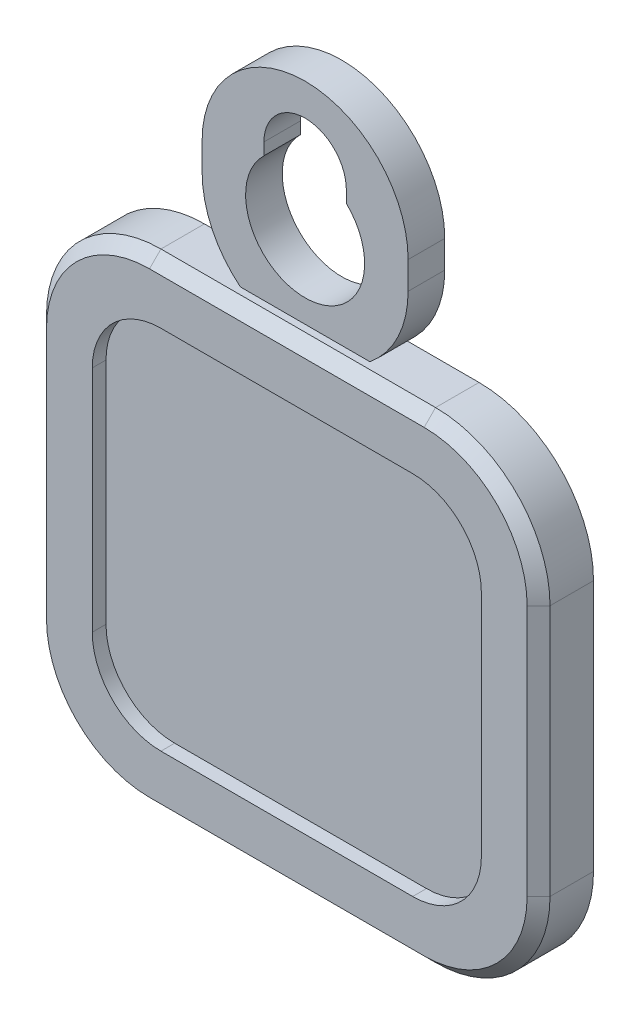
ISO-10303-21;
HEADER;
FILE_DESCRIPTION(('STEP AP214'),'2;1');
FILE_NAME('part.step','',(''),(''),'','','');
FILE_SCHEMA(('AUTOMOTIVE_DESIGN { 1 0 10303 214 1 1 1 1 }'));
ENDSEC;
DATA;
#1=APPLICATION_CONTEXT('core data for automotive mechanical design processes');
#2=APPLICATION_PROTOCOL_DEFINITION('international standard','automotive_design',2000,#1);
#3=PRODUCT_CONTEXT('',#1,'mechanical');
#4=PRODUCT('Part','Part','',(#3));
#5=PRODUCT_RELATED_PRODUCT_CATEGORY('part','',(#4));
#6=PRODUCT_DEFINITION_FORMATION('','',#4);
#7=PRODUCT_DEFINITION_CONTEXT('part definition',#1,'design');
#8=PRODUCT_DEFINITION('design','',#6,#7);
#9=PRODUCT_DEFINITION_SHAPE('','',#8);
#10=(LENGTH_UNIT() NAMED_UNIT(*) SI_UNIT(.MILLI.,.METRE.));
#11=(NAMED_UNIT(*) PLANE_ANGLE_UNIT() SI_UNIT($,.RADIAN.));
#12=(NAMED_UNIT(*) SI_UNIT($,.STERADIAN.) SOLID_ANGLE_UNIT());
#13=UNCERTAINTY_MEASURE_WITH_UNIT(LENGTH_MEASURE(1.E-05),#10,'distance_accuracy_value','');
#14=(GEOMETRIC_REPRESENTATION_CONTEXT(3) GLOBAL_UNCERTAINTY_ASSIGNED_CONTEXT((#13)) GLOBAL_UNIT_ASSIGNED_CONTEXT((#10,
#11,#12)) REPRESENTATION_CONTEXT('',''));
#15=CARTESIAN_POINT('',(0.,0.,0.));
#16=DIRECTION('',(0.,0.,1.));
#17=DIRECTION('',(1.,0.,0.));
#18=AXIS2_PLACEMENT_3D('',#15,#16,#17);
#19=CARTESIAN_POINT('',(-6.,34.,82.7));
#20=DIRECTION('',(0.,0.,1.));
#21=DIRECTION('',(1.,0.,0.));
#22=AXIS2_PLACEMENT_3D('',#19,#20,#21);
#23=PLANE('',#22);
#24=CARTESIAN_POINT('',(6.,45.,82.7));
#25=DIRECTION('',(0.,0.,1.));
#26=DIRECTION('',(1.,0.,0.));
#27=AXIS2_PLACEMENT_3D('',#24,#25,#26);
#28=CIRCLE('',#27,4.5);
#29=CARTESIAN_POINT('',(10.5,45.,82.7));
#30=VERTEX_POINT('',#29);
#31=CARTESIAN_POINT('',(6.,49.5,82.7));
#32=VERTEX_POINT('',#31);
#33=EDGE_CURVE('E522',#30,#32,#28,.T.);
#34=ORIENTED_EDGE('',*,*,#33,.T.);
#35=DIRECTION('',(-1.,0.,0.));
#36=VECTOR('',#35,1.);
#37=CARTESIAN_POINT('',(-6.,49.5,82.7));
#38=LINE('',#37,#36);
#39=CARTESIAN_POINT('',(-6.,49.5,82.7));
#40=VERTEX_POINT('',#39);
#41=EDGE_CURVE('E528',#32,#40,#38,.T.);
#42=ORIENTED_EDGE('',*,*,#41,.T.);
#43=CARTESIAN_POINT('',(-6.,45.,82.7));
#44=DIRECTION('',(0.,0.,1.));
#45=DIRECTION('',(1.,0.,0.));
#46=AXIS2_PLACEMENT_3D('',#43,#44,#45);
#47=CIRCLE('',#46,4.5);
#48=CARTESIAN_POINT('',(-10.5,45.,82.7));
#49=VERTEX_POINT('',#48);
#50=EDGE_CURVE('E525',#40,#49,#47,.T.);
#51=ORIENTED_EDGE('',*,*,#50,.T.);
#52=DIRECTION('',(0.,-1.,0.));
#53=VECTOR('',#52,1.);
#54=CARTESIAN_POINT('',(-10.5,34.,82.7));
#55=LINE('',#54,#53);
#56=CARTESIAN_POINT('',(-10.5,34.,82.7));
#57=VERTEX_POINT('',#56);
#58=EDGE_CURVE('E519',#49,#57,#55,.T.);
#59=ORIENTED_EDGE('',*,*,#58,.T.);
#60=CARTESIAN_POINT('',(-6.,34.,82.7));
#61=DIRECTION('',(0.,0.,1.));
#62=DIRECTION('',(1.,0.,0.));
#63=AXIS2_PLACEMENT_3D('',#60,#61,#62);
#64=CIRCLE('',#63,4.5);
#65=CARTESIAN_POINT('',(-6.,29.5,82.7));
#66=VERTEX_POINT('',#65);
#67=EDGE_CURVE('E513',#57,#66,#64,.T.);
#68=ORIENTED_EDGE('',*,*,#67,.T.);
#69=DIRECTION('',(1.,0.,0.));
#70=VECTOR('',#69,1.);
#71=CARTESIAN_POINT('',(6.,29.5,82.7));
#72=LINE('',#71,#70);
#73=CARTESIAN_POINT('',(6.,29.5,82.7));
#74=VERTEX_POINT('',#73);
#75=EDGE_CURVE('E507',#66,#74,#72,.T.);
#76=ORIENTED_EDGE('',*,*,#75,.T.);
#77=CARTESIAN_POINT('',(6.,34.,82.7));
#78=DIRECTION('',(0.,0.,1.));
#79=DIRECTION('',(1.,0.,0.));
#80=AXIS2_PLACEMENT_3D('',#77,#78,#79);
#81=CIRCLE('',#80,4.5);
#82=CARTESIAN_POINT('',(10.5,34.,82.7));
#83=VERTEX_POINT('',#82);
#84=EDGE_CURVE('E510',#74,#83,#81,.T.);
#85=ORIENTED_EDGE('',*,*,#84,.T.);
#86=DIRECTION('',(0.,1.,0.));
#87=VECTOR('',#86,1.);
#88=CARTESIAN_POINT('',(10.5,45.,82.7));
#89=LINE('',#88,#87);
#90=EDGE_CURVE('E516',#83,#30,#89,.T.);
#91=ORIENTED_EDGE('',*,*,#90,.T.);
#92=EDGE_LOOP('',(#34,#42,#51,#59,#68,#76,#85,#91));
#93=FACE_BOUND('',#92,.T.);
#94=DIRECTION('',(-1.,0.,0.));
#95=VECTOR('',#94,1.);
#96=CARTESIAN_POINT('',(-6.,31.5,82.7));
#97=LINE('',#96,#95);
#98=CARTESIAN_POINT('',(5.5,31.5,82.7));
#99=VERTEX_POINT('',#98);
#100=CARTESIAN_POINT('',(-5.5,31.5,82.7));
#101=VERTEX_POINT('',#100);
#102=EDGE_CURVE('E502',#99,#101,#97,.T.);
#103=ORIENTED_EDGE('',*,*,#102,.T.);
#104=CARTESIAN_POINT('',(-5.5,34.5,82.7));
#105=DIRECTION('',(0.,0.,1.));
#106=DIRECTION('',(1.,0.,0.));
#107=AXIS2_PLACEMENT_3D('',#104,#105,#106);
#108=CIRCLE('',#107,3.);
#109=CARTESIAN_POINT('',(-8.5,34.5,82.7));
#110=VERTEX_POINT('',#109);
#111=EDGE_CURVE('E255',#101,#110,#108,.F.);
#112=ORIENTED_EDGE('',*,*,#111,.T.);
#113=DIRECTION('',(0.,1.,0.));
#114=VECTOR('',#113,1.);
#115=CARTESIAN_POINT('',(-8.5,34.,82.7));
#116=LINE('',#115,#114);
#117=CARTESIAN_POINT('',(-8.5,44.5,82.7));
#118=VERTEX_POINT('',#117);
#119=EDGE_CURVE('E478',#110,#118,#116,.T.);
#120=ORIENTED_EDGE('',*,*,#119,.T.);
#121=CARTESIAN_POINT('',(-5.5,44.5,82.7));
#122=DIRECTION('',(0.,0.,1.));
#123=DIRECTION('',(1.,0.,0.));
#124=AXIS2_PLACEMENT_3D('',#121,#122,#123);
#125=CIRCLE('',#124,3.);
#126=CARTESIAN_POINT('',(-5.5,47.5,82.7));
#127=VERTEX_POINT('',#126);
#128=EDGE_CURVE('E482',#118,#127,#125,.F.);
#129=ORIENTED_EDGE('',*,*,#128,.T.);
#130=DIRECTION('',(1.,0.,0.));
#131=VECTOR('',#130,1.);
#132=CARTESIAN_POINT('',(-6.,47.5,82.7));
#133=LINE('',#132,#131);
#134=CARTESIAN_POINT('',(5.5,47.5,82.7));
#135=VERTEX_POINT('',#134);
#136=EDGE_CURVE('E486',#127,#135,#133,.T.);
#137=ORIENTED_EDGE('',*,*,#136,.T.);
#138=CARTESIAN_POINT('',(5.5,44.5,82.7));
#139=DIRECTION('',(0.,0.,1.));
#140=DIRECTION('',(1.,0.,0.));
#141=AXIS2_PLACEMENT_3D('',#138,#139,#140);
#142=CIRCLE('',#141,3.);
#143=CARTESIAN_POINT('',(8.5,44.5,82.7));
#144=VERTEX_POINT('',#143);
#145=EDGE_CURVE('E490',#135,#144,#142,.F.);
#146=ORIENTED_EDGE('',*,*,#145,.T.);
#147=DIRECTION('',(0.,-1.,0.));
#148=VECTOR('',#147,1.);
#149=CARTESIAN_POINT('',(8.5,34.,82.7));
#150=LINE('',#149,#148);
#151=CARTESIAN_POINT('',(8.5,34.5,82.7));
#152=VERTEX_POINT('',#151);
#153=EDGE_CURVE('E494',#144,#152,#150,.T.);
#154=ORIENTED_EDGE('',*,*,#153,.T.);
#155=CARTESIAN_POINT('',(5.5,34.5,82.7));
#156=DIRECTION('',(0.,0.,1.));
#157=DIRECTION('',(1.,0.,0.));
#158=AXIS2_PLACEMENT_3D('',#155,#156,#157);
#159=CIRCLE('',#158,3.);
#160=EDGE_CURVE('E498',#152,#99,#159,.F.);
#161=ORIENTED_EDGE('',*,*,#160,.T.);
#162=EDGE_LOOP('',(#103,#112,#120,#129,#137,#146,#154,#161));
#163=FACE_BOUND('',#162,.T.);
#164=ADVANCED_FACE('F49',(#93,#163),#23,.T.);
#165=CARTESIAN_POINT('',(-1.8,56.,83.7));
#166=DIRECTION('',(1.,0.,0.));
#167=DIRECTION('',(0.,0.,-1.));
#168=AXIS2_PLACEMENT_3D('',#165,#166,#167);
#169=PLANE('',#168);
#170=DIRECTION('',(0.,1.,0.));
#171=VECTOR('',#170,1.);
#172=CARTESIAN_POINT('',(-1.8,53.5,81.9));
#173=LINE('',#172,#171);
#174=CARTESIAN_POINT('',(-1.8,55.4761663039294,81.9));
#175=VERTEX_POINT('',#174);
#176=CARTESIAN_POINT('',(-1.8,56.,81.9));
#177=VERTEX_POINT('',#176);
#178=EDGE_CURVE('E467',#175,#177,#173,.T.);
#179=ORIENTED_EDGE('',*,*,#178,.F.);
#180=DIRECTION('',(0.,0.,-1.));
#181=VECTOR('',#180,1.);
#182=CARTESIAN_POINT('',(-1.8,55.4761663039294,83.7));
#183=LINE('',#182,#181);
#184=CARTESIAN_POINT('',(-1.8,55.4761663039294,80.3));
#185=VERTEX_POINT('',#184);
#186=EDGE_CURVE('E328',#175,#185,#183,.T.);
#187=ORIENTED_EDGE('',*,*,#186,.T.);
#188=DIRECTION('',(0.,1.,0.));
#189=VECTOR('',#188,1.);
#190=CARTESIAN_POINT('',(-1.8,34.,80.3));
#191=LINE('',#190,#189);
#192=CARTESIAN_POINT('',(-1.8,56.,80.3));
#193=VERTEX_POINT('',#192);
#194=EDGE_CURVE('E343',#185,#193,#191,.T.);
#195=ORIENTED_EDGE('',*,*,#194,.T.);
#196=DIRECTION('',(0.,0.,-1.));
#197=VECTOR('',#196,1.);
#198=CARTESIAN_POINT('',(-1.8,56.,83.7));
#199=LINE('',#198,#197);
#200=EDGE_CURVE('E335',#177,#193,#199,.T.);
#201=ORIENTED_EDGE('',*,*,#200,.F.);
#202=EDGE_LOOP('',(#179,#187,#195,#201));
#203=FACE_BOUND('',#202,.T.);
#204=ADVANCED_FACE('F640',(#203),#169,.T.);
#205=CARTESIAN_POINT('',(1.8,53.6,83.7));
#206=DIRECTION('',(-1.,0.,0.));
#207=DIRECTION('',(0.,0.,1.));
#208=AXIS2_PLACEMENT_3D('',#205,#206,#207);
#209=PLANE('',#208);
#210=DIRECTION('',(0.,-1.,0.));
#211=VECTOR('',#210,1.);
#212=CARTESIAN_POINT('',(1.8,34.,80.3));
#213=LINE('',#212,#211);
#214=CARTESIAN_POINT('',(1.8,56.,80.3));
#215=VERTEX_POINT('',#214);
#216=CARTESIAN_POINT('',(1.8,55.4761663039294,80.3));
#217=VERTEX_POINT('',#216);
#218=EDGE_CURVE('E339',#215,#217,#213,.T.);
#219=ORIENTED_EDGE('',*,*,#218,.T.);
#220=DIRECTION('',(0.,0.,-1.));
#221=VECTOR('',#220,1.);
#222=CARTESIAN_POINT('',(1.8,55.4761663039294,83.7));
#223=LINE('',#222,#221);
#224=CARTESIAN_POINT('',(1.8,55.4761663039294,81.9));
#225=VERTEX_POINT('',#224);
#226=EDGE_CURVE('E474',#217,#225,#223,.F.);
#227=ORIENTED_EDGE('',*,*,#226,.T.);
#228=DIRECTION('',(0.,-1.,0.));
#229=VECTOR('',#228,1.);
#230=CARTESIAN_POINT('',(1.8,53.5,81.9));
#231=LINE('',#230,#229);
#232=CARTESIAN_POINT('',(1.8,56.,81.9));
#233=VERTEX_POINT('',#232);
#234=EDGE_CURVE('E463',#233,#225,#231,.T.);
#235=ORIENTED_EDGE('',*,*,#234,.F.);
#236=DIRECTION('',(0.,0.,-1.));
#237=VECTOR('',#236,1.);
#238=CARTESIAN_POINT('',(1.8,56.,83.7));
#239=LINE('',#238,#237);
#240=EDGE_CURVE('E332',#233,#215,#239,.T.);
#241=ORIENTED_EDGE('',*,*,#240,.T.);
#242=EDGE_LOOP('',(#219,#227,#235,#241));
#243=FACE_BOUND('',#242,.T.);
#244=ADVANCED_FACE('F647',(#243),#209,.T.);
#245=CARTESIAN_POINT('',(-6.,34.,80.3));
#246=DIRECTION('',(0.,0.,1.));
#247=DIRECTION('',(1.,0.,0.));
#248=AXIS2_PLACEMENT_3D('',#245,#246,#247);
#249=PLANE('',#248);
#250=CARTESIAN_POINT('',(0.,53.6,80.3));
#251=DIRECTION('',(0.,0.,1.));
#252=DIRECTION('',(1.,0.,0.));
#253=AXIS2_PLACEMENT_3D('',#250,#251,#252);
#254=CIRCLE('',#253,2.6);
#255=EDGE_CURVE('E325',#217,#185,#254,.F.);
#256=ORIENTED_EDGE('',*,*,#255,.F.);
#257=ORIENTED_EDGE('',*,*,#218,.F.);
#258=CARTESIAN_POINT('',(0.,56.,80.3));
#259=DIRECTION('',(0.,0.,1.));
#260=DIRECTION('',(1.,0.,0.));
#261=AXIS2_PLACEMENT_3D('',#258,#259,#260);
#262=CIRCLE('',#261,1.8);
#263=EDGE_CURVE('E346',#193,#215,#262,.F.);
#264=ORIENTED_EDGE('',*,*,#263,.F.);
#265=ORIENTED_EDGE('',*,*,#194,.F.);
#266=EDGE_LOOP('',(#256,#257,#264,#265));
#267=FACE_BOUND('',#266,.T.);
#268=DIRECTION('',(-1.,0.,0.));
#269=VECTOR('',#268,1.);
#270=CARTESIAN_POINT('',(6.,50.,80.3));
#271=LINE('',#270,#269);
#272=CARTESIAN_POINT('',(-2.82842712474619,50.,80.3));
#273=VERTEX_POINT('',#272);
#274=CARTESIAN_POINT('',(-6.,50.,80.3));
#275=VERTEX_POINT('',#274);
#276=EDGE_CURVE('E424',#273,#275,#271,.T.);
#277=ORIENTED_EDGE('',*,*,#276,.F.);
#278=CARTESIAN_POINT('',(0.,53.5,80.3));
#279=DIRECTION('',(0.,0.,1.));
#280=DIRECTION('',(1.,0.,0.));
#281=AXIS2_PLACEMENT_3D('',#278,#279,#280);
#282=CIRCLE('',#281,4.5);
#283=CARTESIAN_POINT('',(-4.5,53.5,80.3));
#284=VERTEX_POINT('',#283);
#285=EDGE_CURVE('E366',#284,#273,#282,.T.);
#286=ORIENTED_EDGE('',*,*,#285,.F.);
#287=DIRECTION('',(0.,-1.,0.));
#288=VECTOR('',#287,1.);
#289=CARTESIAN_POINT('',(-4.5,54.7,80.3));
#290=LINE('',#289,#288);
#291=CARTESIAN_POINT('',(-4.5,54.7,80.3));
#292=VERTEX_POINT('',#291);
#293=EDGE_CURVE('E377',#292,#284,#290,.T.);
#294=ORIENTED_EDGE('',*,*,#293,.F.);
#295=CARTESIAN_POINT('',(0.,54.7,80.3));
#296=DIRECTION('',(0.,0.,1.));
#297=DIRECTION('',(1.,0.,0.));
#298=AXIS2_PLACEMENT_3D('',#295,#296,#297);
#299=CIRCLE('',#298,4.5);
#300=CARTESIAN_POINT('',(4.5,54.7,80.3));
#301=VERTEX_POINT('',#300);
#302=EDGE_CURVE('E374',#301,#292,#299,.T.);
#303=ORIENTED_EDGE('',*,*,#302,.F.);
#304=DIRECTION('',(0.,1.,0.));
#305=VECTOR('',#304,1.);
#306=CARTESIAN_POINT('',(4.5,53.5,80.3));
#307=LINE('',#306,#305);
#308=CARTESIAN_POINT('',(4.5,53.5,80.3));
#309=VERTEX_POINT('',#308);
#310=EDGE_CURVE('E370',#309,#301,#307,.T.);
#311=ORIENTED_EDGE('',*,*,#310,.F.);
#312=CARTESIAN_POINT('',(2.82842712474619,50.,80.3));
#313=VERTEX_POINT('',#312);
#314=EDGE_CURVE('E350',#313,#309,#282,.T.);
#315=ORIENTED_EDGE('',*,*,#314,.F.);
#316=CARTESIAN_POINT('',(6.,50.,80.3));
#317=VERTEX_POINT('',#316);
#318=EDGE_CURVE('E425',#317,#313,#271,.T.);
#319=ORIENTED_EDGE('',*,*,#318,.F.);
#320=CARTESIAN_POINT('',(6.,45.,80.3));
#321=DIRECTION('',(0.,0.,1.));
#322=DIRECTION('',(1.,0.,0.));
#323=AXIS2_PLACEMENT_3D('',#320,#321,#322);
#324=CIRCLE('',#323,5.);
#325=CARTESIAN_POINT('',(11.,45.,80.3));
#326=VERTEX_POINT('',#325);
#327=EDGE_CURVE('E420',#326,#317,#324,.T.);
#328=ORIENTED_EDGE('',*,*,#327,.F.);
#329=DIRECTION('',(0.,1.,0.));
#330=VECTOR('',#329,1.);
#331=CARTESIAN_POINT('',(11.,34.,80.3));
#332=LINE('',#331,#330);
#333=CARTESIAN_POINT('',(11.,34.,80.3));
#334=VERTEX_POINT('',#333);
#335=EDGE_CURVE('E416',#334,#326,#332,.T.);
#336=ORIENTED_EDGE('',*,*,#335,.F.);
#337=CARTESIAN_POINT('',(6.,34.,80.3));
#338=DIRECTION('',(0.,0.,1.));
#339=DIRECTION('',(1.,0.,0.));
#340=AXIS2_PLACEMENT_3D('',#337,#338,#339);
#341=CIRCLE('',#340,5.);
#342=CARTESIAN_POINT('',(6.,29.,80.3));
#343=VERTEX_POINT('',#342);
#344=EDGE_CURVE('E412',#343,#334,#341,.T.);
#345=ORIENTED_EDGE('',*,*,#344,.F.);
#346=DIRECTION('',(1.,0.,0.));
#347=VECTOR('',#346,1.);
#348=CARTESIAN_POINT('',(-6.,29.,80.3));
#349=LINE('',#348,#347);
#350=CARTESIAN_POINT('',(-6.,29.,80.3));
#351=VERTEX_POINT('',#350);
#352=EDGE_CURVE('E408',#351,#343,#349,.T.);
#353=ORIENTED_EDGE('',*,*,#352,.F.);
#354=CARTESIAN_POINT('',(-6.,34.,80.3));
#355=DIRECTION('',(0.,0.,1.));
#356=DIRECTION('',(1.,0.,0.));
#357=AXIS2_PLACEMENT_3D('',#354,#355,#356);
#358=CIRCLE('',#357,5.);
#359=CARTESIAN_POINT('',(-11.,34.,80.3));
#360=VERTEX_POINT('',#359);
#361=EDGE_CURVE('E404',#360,#351,#358,.T.);
#362=ORIENTED_EDGE('',*,*,#361,.F.);
#363=DIRECTION('',(0.,-1.,0.));
#364=VECTOR('',#363,1.);
#365=CARTESIAN_POINT('',(-11.,45.,80.3));
#366=LINE('',#365,#364);
#367=CARTESIAN_POINT('',(-11.,45.,80.3));
#368=VERTEX_POINT('',#367);
#369=EDGE_CURVE('E432',#368,#360,#366,.T.);
#370=ORIENTED_EDGE('',*,*,#369,.F.);
#371=CARTESIAN_POINT('',(-6.,45.,80.3));
#372=DIRECTION('',(0.,0.,1.));
#373=DIRECTION('',(1.,0.,0.));
#374=AXIS2_PLACEMENT_3D('',#371,#372,#373);
#375=CIRCLE('',#374,5.);
#376=EDGE_CURVE('E428',#275,#368,#375,.T.);
#377=ORIENTED_EDGE('',*,*,#376,.F.);
#378=EDGE_LOOP('',(#277,#286,#294,#303,#311,#315,#319,#328,#336,#345,#353,#362,#370,#377));
#379=FACE_BOUND('',#378,.T.);
#380=ADVANCED_FACE('F654',(#267,#379),#249,.F.);
#381=CARTESIAN_POINT('',(0.,53.5,81.9));
#382=DIRECTION('',(0.,0.,1.));
#383=DIRECTION('',(1.,0.,0.));
#384=AXIS2_PLACEMENT_3D('',#381,#382,#383);
#385=PLANE('',#384);
#386=DIRECTION('',(-1.,0.,0.));
#387=VECTOR('',#386,1.);
#388=CARTESIAN_POINT('',(6.,50.,81.9));
#389=LINE('',#388,#387);
#390=CARTESIAN_POINT('',(2.82842712474619,50.,81.9));
#391=VERTEX_POINT('',#390);
#392=CARTESIAN_POINT('',(-2.82842712474619,50.,81.9));
#393=VERTEX_POINT('',#392);
#394=EDGE_CURVE('E460',#391,#393,#389,.T.);
#395=ORIENTED_EDGE('',*,*,#394,.F.);
#396=CARTESIAN_POINT('',(0.,53.5,81.9));
#397=DIRECTION('',(0.,0.,1.));
#398=DIRECTION('',(1.,0.,0.));
#399=AXIS2_PLACEMENT_3D('',#396,#397,#398);
#400=CIRCLE('',#399,4.5);
#401=CARTESIAN_POINT('',(4.5,53.5,81.9));
#402=VERTEX_POINT('',#401);
#403=EDGE_CURVE('E356',#391,#402,#400,.T.);
#404=ORIENTED_EDGE('',*,*,#403,.T.);
#405=DIRECTION('',(0.,1.,0.));
#406=VECTOR('',#405,1.);
#407=CARTESIAN_POINT('',(4.5,53.5,81.9));
#408=LINE('',#407,#406);
#409=CARTESIAN_POINT('',(4.5,54.7,81.9));
#410=VERTEX_POINT('',#409);
#411=EDGE_CURVE('E355',#402,#410,#408,.T.);
#412=ORIENTED_EDGE('',*,*,#411,.T.);
#413=CARTESIAN_POINT('',(0.,54.7,81.9));
#414=DIRECTION('',(0.,0.,1.));
#415=DIRECTION('',(1.,0.,0.));
#416=AXIS2_PLACEMENT_3D('',#413,#414,#415);
#417=CIRCLE('',#416,4.5);
#418=CARTESIAN_POINT('',(-4.5,54.7,81.9));
#419=VERTEX_POINT('',#418);
#420=EDGE_CURVE('E359',#410,#419,#417,.T.);
#421=ORIENTED_EDGE('',*,*,#420,.T.);
#422=DIRECTION('',(0.,-1.,0.));
#423=VECTOR('',#422,1.);
#424=CARTESIAN_POINT('',(-4.5,54.7,81.9));
#425=LINE('',#424,#423);
#426=CARTESIAN_POINT('',(-4.5,53.5,81.9));
#427=VERTEX_POINT('',#426);
#428=EDGE_CURVE('E362',#419,#427,#425,.T.);
#429=ORIENTED_EDGE('',*,*,#428,.T.);
#430=EDGE_CURVE('E351',#427,#393,#400,.T.);
#431=ORIENTED_EDGE('',*,*,#430,.T.);
#432=EDGE_LOOP('',(#395,#404,#412,#421,#429,#431));
#433=FACE_BOUND('',#432,.T.);
#434=ORIENTED_EDGE('',*,*,#234,.T.);
#435=CARTESIAN_POINT('',(0.,53.6,81.9));
#436=DIRECTION('',(0.,0.,1.));
#437=DIRECTION('',(1.,0.,0.));
#438=AXIS2_PLACEMENT_3D('',#435,#436,#437);
#439=CIRCLE('',#438,2.6);
#440=EDGE_CURVE('E259',#225,#175,#439,.F.);
#441=ORIENTED_EDGE('',*,*,#440,.T.);
#442=ORIENTED_EDGE('',*,*,#178,.T.);
#443=CARTESIAN_POINT('',(0.,56.,81.9));
#444=DIRECTION('',(0.,0.,1.));
#445=DIRECTION('',(1.,0.,0.));
#446=AXIS2_PLACEMENT_3D('',#443,#444,#445);
#447=CIRCLE('',#446,1.8);
#448=EDGE_CURVE('E470',#177,#233,#447,.F.);
#449=ORIENTED_EDGE('',*,*,#448,.T.);
#450=EDGE_LOOP('',(#434,#441,#442,#449));
#451=FACE_BOUND('',#450,.T.);
#452=ADVANCED_FACE('F657',(#433,#451),#385,.T.);
#453=CARTESIAN_POINT('',(6.,50.,82.7));
#454=DIRECTION('',(0.,-1.,0.));
#455=DIRECTION('',(0.,0.,-1.));
#456=AXIS2_PLACEMENT_3D('',#453,#454,#455);
#457=PLANE('',#456);
#458=DIRECTION('',(0.,0.,-1.));
#459=VECTOR('',#458,1.);
#460=CARTESIAN_POINT('',(-6.,50.,82.7));
#461=LINE('',#460,#459);
#462=CARTESIAN_POINT('',(-6.,50.,82.2));
#463=VERTEX_POINT('',#462);
#464=EDGE_CURVE('E442',#463,#275,#461,.T.);
#465=ORIENTED_EDGE('',*,*,#464,.F.);
#466=DIRECTION('',(1.,0.,0.));
#467=VECTOR('',#466,1.);
#468=CARTESIAN_POINT('',(6.,50.,82.2));
#469=LINE('',#468,#467);
#470=CARTESIAN_POINT('',(6.,50.,82.2));
#471=VERTEX_POINT('',#470);
#472=EDGE_CURVE('E532',#463,#471,#469,.T.);
#473=ORIENTED_EDGE('',*,*,#472,.T.);
#474=DIRECTION('',(0.,0.,-1.));
#475=VECTOR('',#474,1.);
#476=CARTESIAN_POINT('',(6.,50.,82.7));
#477=LINE('',#476,#475);
#478=EDGE_CURVE('E445',#471,#317,#477,.T.);
#479=ORIENTED_EDGE('',*,*,#478,.T.);
#480=ORIENTED_EDGE('',*,*,#318,.T.);
#481=DIRECTION('',(0.,0.,-1.));
#482=VECTOR('',#481,1.);
#483=CARTESIAN_POINT('',(2.82842712474619,50.,81.9));
#484=LINE('',#483,#482);
#485=EDGE_CURVE('E396',#391,#313,#484,.T.);
#486=ORIENTED_EDGE('',*,*,#485,.F.);
#487=ORIENTED_EDGE('',*,*,#394,.T.);
#488=DIRECTION('',(0.,0.,-1.));
#489=VECTOR('',#488,1.);
#490=CARTESIAN_POINT('',(-2.82842712474619,50.,81.9));
#491=LINE('',#490,#489);
#492=EDGE_CURVE('E400',#273,#393,#491,.F.);
#493=ORIENTED_EDGE('',*,*,#492,.F.);
#494=ORIENTED_EDGE('',*,*,#276,.T.);
#495=EDGE_LOOP('',(#465,#473,#479,#480,#486,#487,#493,#494));
#496=FACE_BOUND('',#495,.T.);
#497=ADVANCED_FACE('F606',(#496),#457,.F.);
#498=CARTESIAN_POINT('',(-6.,34.,82.7));
#499=DIRECTION('',(0.,0.,-1.));
#500=DIRECTION('',(-1.,0.,0.));
#501=AXIS2_PLACEMENT_3D('',#498,#499,#500);
#502=CYLINDRICAL_SURFACE('',#501,5.);
#503=DIRECTION('',(0.,0.,-1.));
#504=VECTOR('',#503,1.);
#505=CARTESIAN_POINT('',(-6.,29.,82.7));
#506=LINE('',#505,#504);
#507=CARTESIAN_POINT('',(-6.,29.,82.2));
#508=VERTEX_POINT('',#507);
#509=EDGE_CURVE('E457',#508,#351,#506,.T.);
#510=ORIENTED_EDGE('',*,*,#509,.F.);
#511=CARTESIAN_POINT('',(-6.,34.,82.2));
#512=DIRECTION('',(0.,0.,1.));
#513=DIRECTION('',(1.,0.,0.));
#514=AXIS2_PLACEMENT_3D('',#511,#512,#513);
#515=CIRCLE('',#514,5.);
#516=CARTESIAN_POINT('',(-11.,34.,82.2));
#517=VERTEX_POINT('',#516);
#518=EDGE_CURVE('E548',#508,#517,#515,.F.);
#519=ORIENTED_EDGE('',*,*,#518,.T.);
#520=DIRECTION('',(0.,0.,-1.));
#521=VECTOR('',#520,1.);
#522=CARTESIAN_POINT('',(-11.,34.,82.7));
#523=LINE('',#522,#521);
#524=EDGE_CURVE('E436',#517,#360,#523,.T.);
#525=ORIENTED_EDGE('',*,*,#524,.T.);
#526=ORIENTED_EDGE('',*,*,#361,.T.);
#527=EDGE_LOOP('',(#510,#519,#525,#526));
#528=FACE_BOUND('',#527,.T.);
#529=ADVANCED_FACE('F666',(#528),#502,.T.);
#530=CARTESIAN_POINT('',(-6.,29.,82.7));
#531=DIRECTION('',(0.,1.,0.));
#532=DIRECTION('',(0.,0.,1.));
#533=AXIS2_PLACEMENT_3D('',#530,#531,#532);
#534=PLANE('',#533);
#535=DIRECTION('',(0.,0.,-1.));
#536=VECTOR('',#535,1.);
#537=CARTESIAN_POINT('',(6.,29.,82.7));
#538=LINE('',#537,#536);
#539=CARTESIAN_POINT('',(6.,29.,82.2));
#540=VERTEX_POINT('',#539);
#541=EDGE_CURVE('E454',#540,#343,#538,.T.);
#542=ORIENTED_EDGE('',*,*,#541,.F.);
#543=DIRECTION('',(-1.,0.,0.));
#544=VECTOR('',#543,1.);
#545=CARTESIAN_POINT('',(-6.,29.,82.2));
#546=LINE('',#545,#544);
#547=EDGE_CURVE('E11',#540,#508,#546,.T.);
#548=ORIENTED_EDGE('',*,*,#547,.T.);
#549=ORIENTED_EDGE('',*,*,#509,.T.);
#550=ORIENTED_EDGE('',*,*,#352,.T.);
#551=EDGE_LOOP('',(#542,#548,#549,#550));
#552=FACE_BOUND('',#551,.T.);
#553=ADVANCED_FACE('F674',(#552),#534,.F.);
#554=CARTESIAN_POINT('',(6.,34.,82.7));
#555=DIRECTION('',(0.,0.,-1.));
#556=DIRECTION('',(-1.,0.,0.));
#557=AXIS2_PLACEMENT_3D('',#554,#555,#556);
#558=CYLINDRICAL_SURFACE('',#557,5.);
#559=DIRECTION('',(0.,0.,-1.));
#560=VECTOR('',#559,1.);
#561=CARTESIAN_POINT('',(11.,34.,82.7));
#562=LINE('',#561,#560);
#563=CARTESIAN_POINT('',(11.,34.,82.2));
#564=VERTEX_POINT('',#563);
#565=EDGE_CURVE('E451',#564,#334,#562,.T.);
#566=ORIENTED_EDGE('',*,*,#565,.F.);
#567=CARTESIAN_POINT('',(6.,34.,82.2));
#568=DIRECTION('',(0.,0.,1.));
#569=DIRECTION('',(1.,0.,0.));
#570=AXIS2_PLACEMENT_3D('',#567,#568,#569);
#571=CIRCLE('',#570,5.);
#572=EDGE_CURVE('E60',#564,#540,#571,.F.);
#573=ORIENTED_EDGE('',*,*,#572,.T.);
#574=ORIENTED_EDGE('',*,*,#541,.T.);
#575=ORIENTED_EDGE('',*,*,#344,.T.);
#576=EDGE_LOOP('',(#566,#573,#574,#575));
#577=FACE_BOUND('',#576,.T.);
#578=ADVANCED_FACE('F671',(#577),#558,.T.);
#579=CARTESIAN_POINT('',(11.,34.,82.7));
#580=DIRECTION('',(-1.,0.,0.));
#581=DIRECTION('',(0.,0.,1.));
#582=AXIS2_PLACEMENT_3D('',#579,#580,#581);
#583=PLANE('',#582);
#584=DIRECTION('',(0.,0.,-1.));
#585=VECTOR('',#584,1.);
#586=CARTESIAN_POINT('',(11.,45.,82.7));
#587=LINE('',#586,#585);
#588=CARTESIAN_POINT('',(11.,45.,82.2));
#589=VERTEX_POINT('',#588);
#590=EDGE_CURVE('E448',#589,#326,#587,.T.);
#591=ORIENTED_EDGE('',*,*,#590,.F.);
#592=DIRECTION('',(0.,-1.,0.));
#593=VECTOR('',#592,1.);
#594=CARTESIAN_POINT('',(11.,34.,82.2));
#595=LINE('',#594,#593);
#596=EDGE_CURVE('E545',#589,#564,#595,.T.);
#597=ORIENTED_EDGE('',*,*,#596,.T.);
#598=ORIENTED_EDGE('',*,*,#565,.T.);
#599=ORIENTED_EDGE('',*,*,#335,.T.);
#600=EDGE_LOOP('',(#591,#597,#598,#599));
#601=FACE_BOUND('',#600,.T.);
#602=ADVANCED_FACE('F624',(#601),#583,.F.);
#603=CARTESIAN_POINT('',(6.,45.,82.7));
#604=DIRECTION('',(0.,0.,-1.));
#605=DIRECTION('',(-1.,0.,0.));
#606=AXIS2_PLACEMENT_3D('',#603,#604,#605);
#607=CYLINDRICAL_SURFACE('',#606,5.);
#608=ORIENTED_EDGE('',*,*,#478,.F.);
#609=CARTESIAN_POINT('',(6.,45.,82.2));
#610=DIRECTION('',(0.,0.,1.));
#611=DIRECTION('',(1.,0.,0.));
#612=AXIS2_PLACEMENT_3D('',#609,#610,#611);
#613=CIRCLE('',#612,5.);
#614=EDGE_CURVE('E539',#471,#589,#613,.F.);
#615=ORIENTED_EDGE('',*,*,#614,.T.);
#616=ORIENTED_EDGE('',*,*,#590,.T.);
#617=ORIENTED_EDGE('',*,*,#327,.T.);
#618=EDGE_LOOP('',(#608,#615,#616,#617));
#619=FACE_BOUND('',#618,.T.);
#620=ADVANCED_FACE('F621',(#619),#607,.T.);
#621=CARTESIAN_POINT('',(-6.,45.,82.7));
#622=DIRECTION('',(0.,0.,-1.));
#623=DIRECTION('',(-1.,0.,0.));
#624=AXIS2_PLACEMENT_3D('',#621,#622,#623);
#625=CYLINDRICAL_SURFACE('',#624,5.);
#626=DIRECTION('',(0.,0.,-1.));
#627=VECTOR('',#626,1.);
#628=CARTESIAN_POINT('',(-11.,45.,82.7));
#629=LINE('',#628,#627);
#630=CARTESIAN_POINT('',(-11.,45.,82.2));
#631=VERTEX_POINT('',#630);
#632=EDGE_CURVE('E439',#631,#368,#629,.T.);
#633=ORIENTED_EDGE('',*,*,#632,.F.);
#634=CARTESIAN_POINT('',(-6.,45.,82.2));
#635=DIRECTION('',(0.,0.,1.));
#636=DIRECTION('',(1.,0.,0.));
#637=AXIS2_PLACEMENT_3D('',#634,#635,#636);
#638=CIRCLE('',#637,5.);
#639=EDGE_CURVE('E536',#631,#463,#638,.F.);
#640=ORIENTED_EDGE('',*,*,#639,.T.);
#641=ORIENTED_EDGE('',*,*,#464,.T.);
#642=ORIENTED_EDGE('',*,*,#376,.T.);
#643=EDGE_LOOP('',(#633,#640,#641,#642));
#644=FACE_BOUND('',#643,.T.);
#645=ADVANCED_FACE('F602',(#644),#625,.T.);
#646=CARTESIAN_POINT('',(-11.,45.,82.7));
#647=DIRECTION('',(1.,0.,0.));
#648=DIRECTION('',(0.,0.,-1.));
#649=AXIS2_PLACEMENT_3D('',#646,#647,#648);
#650=PLANE('',#649);
#651=ORIENTED_EDGE('',*,*,#524,.F.);
#652=DIRECTION('',(0.,1.,0.));
#653=VECTOR('',#652,1.);
#654=CARTESIAN_POINT('',(-11.,45.,82.2));
#655=LINE('',#654,#653);
#656=EDGE_CURVE('E542',#517,#631,#655,.T.);
#657=ORIENTED_EDGE('',*,*,#656,.T.);
#658=ORIENTED_EDGE('',*,*,#632,.T.);
#659=ORIENTED_EDGE('',*,*,#369,.T.);
#660=EDGE_LOOP('',(#651,#657,#658,#659));
#661=FACE_BOUND('',#660,.T.);
#662=ADVANCED_FACE('F659',(#661),#650,.F.);
#663=CARTESIAN_POINT('',(0.,53.5,81.9));
#664=DIRECTION('',(0.,0.,-1.));
#665=DIRECTION('',(-1.,0.,0.));
#666=AXIS2_PLACEMENT_3D('',#663,#664,#665);
#667=CYLINDRICAL_SURFACE('',#666,4.5);
#668=ORIENTED_EDGE('',*,*,#285,.T.);
#669=ORIENTED_EDGE('',*,*,#492,.T.);
#670=ORIENTED_EDGE('',*,*,#430,.F.);
#671=DIRECTION('',(0.,0.,-1.));
#672=VECTOR('',#671,1.);
#673=CARTESIAN_POINT('',(-4.5,53.5,81.9));
#674=LINE('',#673,#672);
#675=EDGE_CURVE('E365',#427,#284,#674,.T.);
#676=ORIENTED_EDGE('',*,*,#675,.T.);
#677=EDGE_LOOP('',(#668,#669,#670,#676));
#678=FACE_BOUND('',#677,.T.);
#679=ADVANCED_FACE('F652',(#678),#667,.T.);
#680=ORIENTED_EDGE('',*,*,#403,.F.);
#681=ORIENTED_EDGE('',*,*,#485,.T.);
#682=ORIENTED_EDGE('',*,*,#314,.T.);
#683=DIRECTION('',(0.,0.,-1.));
#684=VECTOR('',#683,1.);
#685=CARTESIAN_POINT('',(4.5,53.5,81.9));
#686=LINE('',#685,#684);
#687=EDGE_CURVE('E392',#402,#309,#686,.T.);
#688=ORIENTED_EDGE('',*,*,#687,.F.);
#689=EDGE_LOOP('',(#680,#681,#682,#688));
#690=FACE_BOUND('',#689,.T.);
#691=ADVANCED_FACE('F856',(#690),#667,.T.);
#692=CARTESIAN_POINT('',(4.5,53.5,81.9));
#693=DIRECTION('',(-1.,0.,0.));
#694=DIRECTION('',(0.,0.,1.));
#695=AXIS2_PLACEMENT_3D('',#692,#693,#694);
#696=PLANE('',#695);
#697=ORIENTED_EDGE('',*,*,#310,.T.);
#698=DIRECTION('',(0.,0.,-1.));
#699=VECTOR('',#698,1.);
#700=CARTESIAN_POINT('',(4.5,54.7,81.9));
#701=LINE('',#700,#699);
#702=EDGE_CURVE('E388',#410,#301,#701,.T.);
#703=ORIENTED_EDGE('',*,*,#702,.F.);
#704=ORIENTED_EDGE('',*,*,#411,.F.);
#705=ORIENTED_EDGE('',*,*,#687,.T.);
#706=EDGE_LOOP('',(#697,#703,#704,#705));
#707=FACE_BOUND('',#706,.T.);
#708=ADVANCED_FACE('F859',(#707),#696,.F.);
#709=CARTESIAN_POINT('',(0.,54.7,81.9));
#710=DIRECTION('',(0.,0.,-1.));
#711=DIRECTION('',(-1.,0.,0.));
#712=AXIS2_PLACEMENT_3D('',#709,#710,#711);
#713=CYLINDRICAL_SURFACE('',#712,4.5);
#714=ORIENTED_EDGE('',*,*,#302,.T.);
#715=DIRECTION('',(0.,0.,-1.));
#716=VECTOR('',#715,1.);
#717=CARTESIAN_POINT('',(-4.5,54.7,81.9));
#718=LINE('',#717,#716);
#719=EDGE_CURVE('E384',#419,#292,#718,.T.);
#720=ORIENTED_EDGE('',*,*,#719,.F.);
#721=ORIENTED_EDGE('',*,*,#420,.F.);
#722=ORIENTED_EDGE('',*,*,#702,.T.);
#723=EDGE_LOOP('',(#714,#720,#721,#722));
#724=FACE_BOUND('',#723,.T.);
#725=ADVANCED_FACE('F931',(#724),#713,.T.);
#726=CARTESIAN_POINT('',(-4.5,54.7,81.9));
#727=DIRECTION('',(1.,0.,0.));
#728=DIRECTION('',(0.,0.,-1.));
#729=AXIS2_PLACEMENT_3D('',#726,#727,#728);
#730=PLANE('',#729);
#731=ORIENTED_EDGE('',*,*,#293,.T.);
#732=ORIENTED_EDGE('',*,*,#675,.F.);
#733=ORIENTED_EDGE('',*,*,#428,.F.);
#734=ORIENTED_EDGE('',*,*,#719,.T.);
#735=EDGE_LOOP('',(#731,#732,#733,#734));
#736=FACE_BOUND('',#735,.T.);
#737=ADVANCED_FACE('F939',(#736),#730,.F.);
#738=CARTESIAN_POINT('',(0.,56.,83.7));
#739=DIRECTION('',(0.,0.,-1.));
#740=DIRECTION('',(-1.,0.,0.));
#741=AXIS2_PLACEMENT_3D('',#738,#739,#740);
#742=CYLINDRICAL_SURFACE('',#741,1.8);
#743=ORIENTED_EDGE('',*,*,#263,.T.);
#744=ORIENTED_EDGE('',*,*,#240,.F.);
#745=ORIENTED_EDGE('',*,*,#448,.F.);
#746=ORIENTED_EDGE('',*,*,#200,.T.);
#747=EDGE_LOOP('',(#743,#744,#745,#746));
#748=FACE_BOUND('',#747,.T.);
#749=ADVANCED_FACE('F849',(#748),#742,.F.);
#750=CARTESIAN_POINT('',(0.,53.6,83.7));
#751=DIRECTION('',(0.,0.,-1.));
#752=DIRECTION('',(-1.,0.,0.));
#753=AXIS2_PLACEMENT_3D('',#750,#751,#752);
#754=CYLINDRICAL_SURFACE('',#753,2.6);
#755=ORIENTED_EDGE('',*,*,#440,.F.);
#756=ORIENTED_EDGE('',*,*,#226,.F.);
#757=ORIENTED_EDGE('',*,*,#255,.T.);
#758=ORIENTED_EDGE('',*,*,#186,.F.);
#759=EDGE_LOOP('',(#755,#756,#757,#758));
#760=FACE_BOUND('',#759,.T.);
#761=ADVANCED_FACE('F836',(#760),#754,.F.);
#762=CARTESIAN_POINT('',(-5.5,34.5,83.7));
#763=DIRECTION('',(0.,0.,-1.));
#764=DIRECTION('',(-1.,0.,0.));
#765=AXIS2_PLACEMENT_3D('',#762,#763,#764);
#766=CYLINDRICAL_SURFACE('',#765,3.);
#767=DIRECTION('',(0.,0.,-1.));
#768=VECTOR('',#767,1.);
#769=CARTESIAN_POINT('',(-5.5,31.5,83.7));
#770=LINE('',#769,#768);
#771=CARTESIAN_POINT('',(-5.5,31.5,82.1));
#772=VERTEX_POINT('',#771);
#773=EDGE_CURVE('E248',#101,#772,#770,.T.);
#774=ORIENTED_EDGE('',*,*,#773,.T.);
#775=CARTESIAN_POINT('',(-5.5,34.5,82.1));
#776=DIRECTION('',(0.,0.,1.));
#777=DIRECTION('',(1.,0.,0.));
#778=AXIS2_PLACEMENT_3D('',#775,#776,#777);
#779=CIRCLE('',#778,3.);
#780=CARTESIAN_POINT('',(-8.5,34.5,82.1));
#781=VERTEX_POINT('',#780);
#782=EDGE_CURVE('E253',#781,#772,#779,.T.);
#783=ORIENTED_EDGE('',*,*,#782,.F.);
#784=DIRECTION('',(0.,0.,-1.));
#785=VECTOR('',#784,1.);
#786=CARTESIAN_POINT('',(-8.5,34.5,83.7));
#787=LINE('',#786,#785);
#788=EDGE_CURVE('E302',#110,#781,#787,.T.);
#789=ORIENTED_EDGE('',*,*,#788,.F.);
#790=ORIENTED_EDGE('',*,*,#111,.F.);
#791=EDGE_LOOP('',(#774,#783,#789,#790));
#792=FACE_BOUND('',#791,.T.);
#793=ADVANCED_FACE('F250',(#792),#766,.F.);
#794=CARTESIAN_POINT('',(-5.5,31.5,83.7));
#795=DIRECTION('',(0.,1.,0.));
#796=DIRECTION('',(0.,0.,1.));
#797=AXIS2_PLACEMENT_3D('',#794,#795,#796);
#798=PLANE('',#797);
#799=DIRECTION('',(0.,0.,-1.));
#800=VECTOR('',#799,1.);
#801=CARTESIAN_POINT('',(5.5,31.5,83.7));
#802=LINE('',#801,#800);
#803=CARTESIAN_POINT('',(5.5,31.5,82.1));
#804=VERTEX_POINT('',#803);
#805=EDGE_CURVE('E260',#99,#804,#802,.T.);
#806=ORIENTED_EDGE('',*,*,#805,.T.);
#807=DIRECTION('',(1.,0.,0.));
#808=VECTOR('',#807,1.);
#809=CARTESIAN_POINT('',(-5.5,31.5,82.1));
#810=LINE('',#809,#808);
#811=EDGE_CURVE('E263',#772,#804,#810,.T.);
#812=ORIENTED_EDGE('',*,*,#811,.F.);
#813=ORIENTED_EDGE('',*,*,#773,.F.);
#814=ORIENTED_EDGE('',*,*,#102,.F.);
#815=EDGE_LOOP('',(#806,#812,#813,#814));
#816=FACE_BOUND('',#815,.T.);
#817=ADVANCED_FACE('F264',(#816),#798,.T.);
#818=CARTESIAN_POINT('',(5.5,34.5,83.7));
#819=DIRECTION('',(0.,0.,-1.));
#820=DIRECTION('',(-1.,0.,0.));
#821=AXIS2_PLACEMENT_3D('',#818,#819,#820);
#822=CYLINDRICAL_SURFACE('',#821,3.);
#823=DIRECTION('',(0.,0.,-1.));
#824=VECTOR('',#823,1.);
#825=CARTESIAN_POINT('',(8.5,34.5,83.7));
#826=LINE('',#825,#824);
#827=CARTESIAN_POINT('',(8.5,34.5,82.1));
#828=VERTEX_POINT('',#827);
#829=EDGE_CURVE('E317',#152,#828,#826,.T.);
#830=ORIENTED_EDGE('',*,*,#829,.T.);
#831=CARTESIAN_POINT('',(5.5,34.5,82.1));
#832=DIRECTION('',(0.,0.,1.));
#833=DIRECTION('',(1.,0.,0.));
#834=AXIS2_PLACEMENT_3D('',#831,#832,#833);
#835=CIRCLE('',#834,3.);
#836=EDGE_CURVE('E270',#804,#828,#835,.T.);
#837=ORIENTED_EDGE('',*,*,#836,.F.);
#838=ORIENTED_EDGE('',*,*,#805,.F.);
#839=ORIENTED_EDGE('',*,*,#160,.F.);
#840=EDGE_LOOP('',(#830,#837,#838,#839));
#841=FACE_BOUND('',#840,.T.);
#842=ADVANCED_FACE('F809',(#841),#822,.F.);
#843=CARTESIAN_POINT('',(8.5,34.5,83.7));
#844=DIRECTION('',(-1.,0.,0.));
#845=DIRECTION('',(0.,0.,1.));
#846=AXIS2_PLACEMENT_3D('',#843,#844,#845);
#847=PLANE('',#846);
#848=DIRECTION('',(0.,0.,-1.));
#849=VECTOR('',#848,1.);
#850=CARTESIAN_POINT('',(8.5,44.5,83.7));
#851=LINE('',#850,#849);
#852=CARTESIAN_POINT('',(8.5,44.5,82.1));
#853=VERTEX_POINT('',#852);
#854=EDGE_CURVE('E314',#144,#853,#851,.T.);
#855=ORIENTED_EDGE('',*,*,#854,.T.);
#856=DIRECTION('',(0.,1.,0.));
#857=VECTOR('',#856,1.);
#858=CARTESIAN_POINT('',(8.5,34.5,82.1));
#859=LINE('',#858,#857);
#860=EDGE_CURVE('E285',#828,#853,#859,.T.);
#861=ORIENTED_EDGE('',*,*,#860,.F.);
#862=ORIENTED_EDGE('',*,*,#829,.F.);
#863=ORIENTED_EDGE('',*,*,#153,.F.);
#864=EDGE_LOOP('',(#855,#861,#862,#863));
#865=FACE_BOUND('',#864,.T.);
#866=ADVANCED_FACE('F799',(#865),#847,.T.);
#867=CARTESIAN_POINT('',(5.5,44.5,83.7));
#868=DIRECTION('',(0.,0.,-1.));
#869=DIRECTION('',(-1.,0.,0.));
#870=AXIS2_PLACEMENT_3D('',#867,#868,#869);
#871=CYLINDRICAL_SURFACE('',#870,3.);
#872=DIRECTION('',(0.,0.,-1.));
#873=VECTOR('',#872,1.);
#874=CARTESIAN_POINT('',(5.5,47.5,83.7));
#875=LINE('',#874,#873);
#876=CARTESIAN_POINT('',(5.5,47.5,82.1));
#877=VERTEX_POINT('',#876);
#878=EDGE_CURVE('E311',#135,#877,#875,.T.);
#879=ORIENTED_EDGE('',*,*,#878,.T.);
#880=CARTESIAN_POINT('',(5.5,44.5,82.1));
#881=DIRECTION('',(0.,0.,1.));
#882=DIRECTION('',(1.,0.,0.));
#883=AXIS2_PLACEMENT_3D('',#880,#881,#882);
#884=CIRCLE('',#883,3.);
#885=EDGE_CURVE('E289',#853,#877,#884,.T.);
#886=ORIENTED_EDGE('',*,*,#885,.F.);
#887=ORIENTED_EDGE('',*,*,#854,.F.);
#888=ORIENTED_EDGE('',*,*,#145,.F.);
#889=EDGE_LOOP('',(#879,#886,#887,#888));
#890=FACE_BOUND('',#889,.T.);
#891=ADVANCED_FACE('F789',(#890),#871,.F.);
#892=CARTESIAN_POINT('',(5.5,47.5,83.7));
#893=DIRECTION('',(0.,-1.,0.));
#894=DIRECTION('',(0.,0.,-1.));
#895=AXIS2_PLACEMENT_3D('',#892,#893,#894);
#896=PLANE('',#895);
#897=DIRECTION('',(0.,0.,-1.));
#898=VECTOR('',#897,1.);
#899=CARTESIAN_POINT('',(-5.5,47.5,83.7));
#900=LINE('',#899,#898);
#901=CARTESIAN_POINT('',(-5.5,47.5,82.1));
#902=VERTEX_POINT('',#901);
#903=EDGE_CURVE('E308',#127,#902,#900,.T.);
#904=ORIENTED_EDGE('',*,*,#903,.T.);
#905=DIRECTION('',(-1.,0.,0.));
#906=VECTOR('',#905,1.);
#907=CARTESIAN_POINT('',(5.5,47.5,82.1));
#908=LINE('',#907,#906);
#909=EDGE_CURVE('E293',#877,#902,#908,.T.);
#910=ORIENTED_EDGE('',*,*,#909,.F.);
#911=ORIENTED_EDGE('',*,*,#878,.F.);
#912=ORIENTED_EDGE('',*,*,#136,.F.);
#913=EDGE_LOOP('',(#904,#910,#911,#912));
#914=FACE_BOUND('',#913,.T.);
#915=ADVANCED_FACE('F779',(#914),#896,.T.);
#916=CARTESIAN_POINT('',(-5.5,44.5,83.7));
#917=DIRECTION('',(0.,0.,-1.));
#918=DIRECTION('',(-1.,0.,0.));
#919=AXIS2_PLACEMENT_3D('',#916,#917,#918);
#920=CYLINDRICAL_SURFACE('',#919,3.);
#921=DIRECTION('',(0.,0.,-1.));
#922=VECTOR('',#921,1.);
#923=CARTESIAN_POINT('',(-8.5,44.5,83.7));
#924=LINE('',#923,#922);
#925=CARTESIAN_POINT('',(-8.5,44.5,82.1));
#926=VERTEX_POINT('',#925);
#927=EDGE_CURVE('E305',#118,#926,#924,.T.);
#928=ORIENTED_EDGE('',*,*,#927,.T.);
#929=CARTESIAN_POINT('',(-5.5,44.5,82.1));
#930=DIRECTION('',(0.,0.,1.));
#931=DIRECTION('',(1.,0.,0.));
#932=AXIS2_PLACEMENT_3D('',#929,#930,#931);
#933=CIRCLE('',#932,3.);
#934=EDGE_CURVE('E297',#902,#926,#933,.T.);
#935=ORIENTED_EDGE('',*,*,#934,.F.);
#936=ORIENTED_EDGE('',*,*,#903,.F.);
#937=ORIENTED_EDGE('',*,*,#128,.F.);
#938=EDGE_LOOP('',(#928,#935,#936,#937));
#939=FACE_BOUND('',#938,.T.);
#940=ADVANCED_FACE('F769',(#939),#920,.F.);
#941=CARTESIAN_POINT('',(-8.5,44.5,83.7));
#942=DIRECTION('',(1.,0.,0.));
#943=DIRECTION('',(0.,0.,-1.));
#944=AXIS2_PLACEMENT_3D('',#941,#942,#943);
#945=PLANE('',#944);
#946=ORIENTED_EDGE('',*,*,#788,.T.);
#947=DIRECTION('',(0.,-1.,0.));
#948=VECTOR('',#947,1.);
#949=CARTESIAN_POINT('',(-8.5,44.5,82.1));
#950=LINE('',#949,#948);
#951=EDGE_CURVE('E276',#926,#781,#950,.T.);
#952=ORIENTED_EDGE('',*,*,#951,.F.);
#953=ORIENTED_EDGE('',*,*,#927,.F.);
#954=ORIENTED_EDGE('',*,*,#119,.F.);
#955=EDGE_LOOP('',(#946,#952,#953,#954));
#956=FACE_BOUND('',#955,.T.);
#957=ADVANCED_FACE('F761',(#956),#945,.T.);
#958=CARTESIAN_POINT('',(-5.5,34.5,82.1));
#959=DIRECTION('',(0.,0.,1.));
#960=DIRECTION('',(1.,0.,0.));
#961=AXIS2_PLACEMENT_3D('',#958,#959,#960);
#962=PLANE('',#961);
#963=ORIENTED_EDGE('',*,*,#782,.T.);
#964=ORIENTED_EDGE('',*,*,#811,.T.);
#965=ORIENTED_EDGE('',*,*,#836,.T.);
#966=ORIENTED_EDGE('',*,*,#860,.T.);
#967=ORIENTED_EDGE('',*,*,#885,.T.);
#968=ORIENTED_EDGE('',*,*,#909,.T.);
#969=ORIENTED_EDGE('',*,*,#934,.T.);
#970=ORIENTED_EDGE('',*,*,#951,.T.);
#971=EDGE_LOOP('',(#963,#964,#965,#966,#967,#968,#969,#970));
#972=FACE_BOUND('',#971,.T.);
#973=ADVANCED_FACE('F273',(#972),#962,.T.);
#974=CARTESIAN_POINT('',(-6.,29.5,82.7));
#975=DIRECTION('',(0.,-0.707106781186547,0.707106781186547));
#976=DIRECTION('',(-1.,0.,0.));
#977=AXIS2_PLACEMENT_3D('',#974,#975,#976);
#978=PLANE('',#977);
#979=DIRECTION('',(0.,0.707106781186547,0.707106781186547));
#980=VECTOR('',#979,1.);
#981=CARTESIAN_POINT('',(-6.,29.,82.2));
#982=LINE('',#981,#980);
#983=EDGE_CURVE('E281',#508,#66,#982,.T.);
#984=ORIENTED_EDGE('',*,*,#983,.F.);
#985=ORIENTED_EDGE('',*,*,#547,.F.);
#986=DIRECTION('',(0.,-0.707106781186547,-0.707106781186547));
#987=VECTOR('',#986,1.);
#988=CARTESIAN_POINT('',(6.,29.5,82.7));
#989=LINE('',#988,#987);
#990=EDGE_CURVE('E54',#74,#540,#989,.T.);
#991=ORIENTED_EDGE('',*,*,#990,.F.);
#992=ORIENTED_EDGE('',*,*,#75,.F.);
#993=EDGE_LOOP('',(#984,#985,#991,#992));
#994=FACE_BOUND('',#993,.T.);
#995=ADVANCED_FACE('F52',(#994),#978,.T.);
#996=CARTESIAN_POINT('',(6.,34.,82.7));
#997=DIRECTION('',(0.,0.,-1.));
#998=DIRECTION('',(-1.,0.,0.));
#999=AXIS2_PLACEMENT_3D('',#996,#997,#998);
#1000=CONICAL_SURFACE('',#999,4.5,0.785398163397449);
#1001=ORIENTED_EDGE('',*,*,#990,.T.);
#1002=ORIENTED_EDGE('',*,*,#572,.F.);
#1003=DIRECTION('',(0.707106781186547,0.,-0.707106781186547));
#1004=VECTOR('',#1003,1.);
#1005=CARTESIAN_POINT('',(10.5,34.,82.7));
#1006=LINE('',#1005,#1004);
#1007=EDGE_CURVE('E571',#83,#564,#1006,.T.);
#1008=ORIENTED_EDGE('',*,*,#1007,.F.);
#1009=ORIENTED_EDGE('',*,*,#84,.F.);
#1010=EDGE_LOOP('',(#1001,#1002,#1008,#1009));
#1011=FACE_BOUND('',#1010,.T.);
#1012=ADVANCED_FACE('F631',(#1011),#1000,.T.);
#1013=CARTESIAN_POINT('',(-6.,34.,82.7));
#1014=DIRECTION('',(0.,0.,-1.));
#1015=DIRECTION('',(-1.,0.,0.));
#1016=AXIS2_PLACEMENT_3D('',#1013,#1014,#1015);
#1017=CONICAL_SURFACE('',#1016,4.5,0.785398163397447);
#1018=ORIENTED_EDGE('',*,*,#983,.T.);
#1019=ORIENTED_EDGE('',*,*,#67,.F.);
#1020=DIRECTION('',(0.707106781186546,0.,0.707106781186549));
#1021=VECTOR('',#1020,1.);
#1022=CARTESIAN_POINT('',(-11.,34.,82.2));
#1023=LINE('',#1022,#1021);
#1024=EDGE_CURVE('E567',#517,#57,#1023,.T.);
#1025=ORIENTED_EDGE('',*,*,#1024,.F.);
#1026=ORIENTED_EDGE('',*,*,#518,.F.);
#1027=EDGE_LOOP('',(#1018,#1019,#1025,#1026));
#1028=FACE_BOUND('',#1027,.T.);
#1029=ADVANCED_FACE('F580',(#1028),#1017,.T.);
#1030=CARTESIAN_POINT('',(10.5,34.,82.7));
#1031=DIRECTION('',(0.707106781186549,0.,0.707106781186546));
#1032=DIRECTION('',(0.,-1.,0.));
#1033=AXIS2_PLACEMENT_3D('',#1030,#1031,#1032);
#1034=PLANE('',#1033);
#1035=ORIENTED_EDGE('',*,*,#1007,.T.);
#1036=ORIENTED_EDGE('',*,*,#596,.F.);
#1037=DIRECTION('',(0.707106781186546,0.,-0.707106781186549));
#1038=VECTOR('',#1037,1.);
#1039=CARTESIAN_POINT('',(10.5,45.,82.7));
#1040=LINE('',#1039,#1038);
#1041=EDGE_CURVE('E563',#30,#589,#1040,.T.);
#1042=ORIENTED_EDGE('',*,*,#1041,.F.);
#1043=ORIENTED_EDGE('',*,*,#90,.F.);
#1044=EDGE_LOOP('',(#1035,#1036,#1042,#1043));
#1045=FACE_BOUND('',#1044,.T.);
#1046=ADVANCED_FACE('F628',(#1045),#1034,.T.);
#1047=CARTESIAN_POINT('',(-10.5,34.,82.7));
#1048=DIRECTION('',(-0.707106781186547,0.,0.707106781186547));
#1049=DIRECTION('',(0.,1.,0.));
#1050=AXIS2_PLACEMENT_3D('',#1047,#1048,#1049);
#1051=PLANE('',#1050);
#1052=ORIENTED_EDGE('',*,*,#1024,.T.);
#1053=ORIENTED_EDGE('',*,*,#58,.F.);
#1054=DIRECTION('',(0.707106781186547,0.,0.707106781186547));
#1055=VECTOR('',#1054,1.);
#1056=CARTESIAN_POINT('',(-11.,45.,82.2));
#1057=LINE('',#1056,#1055);
#1058=EDGE_CURVE('E559',#631,#49,#1057,.T.);
#1059=ORIENTED_EDGE('',*,*,#1058,.F.);
#1060=ORIENTED_EDGE('',*,*,#656,.F.);
#1061=EDGE_LOOP('',(#1052,#1053,#1059,#1060));
#1062=FACE_BOUND('',#1061,.T.);
#1063=ADVANCED_FACE('F593',(#1062),#1051,.T.);
#1064=CARTESIAN_POINT('',(6.,45.,82.7));
#1065=DIRECTION('',(0.,0.,-1.));
#1066=DIRECTION('',(-1.,0.,0.));
#1067=AXIS2_PLACEMENT_3D('',#1064,#1065,#1066);
#1068=CONICAL_SURFACE('',#1067,4.5,0.785398163397446);
#1069=ORIENTED_EDGE('',*,*,#1041,.T.);
#1070=ORIENTED_EDGE('',*,*,#614,.F.);
#1071=DIRECTION('',(0.,0.707106781186547,-0.707106781186547));
#1072=VECTOR('',#1071,1.);
#1073=CARTESIAN_POINT('',(6.,49.5,82.7));
#1074=LINE('',#1073,#1072);
#1075=EDGE_CURVE('E556',#32,#471,#1074,.T.);
#1076=ORIENTED_EDGE('',*,*,#1075,.F.);
#1077=ORIENTED_EDGE('',*,*,#33,.F.);
#1078=EDGE_LOOP('',(#1069,#1070,#1076,#1077));
#1079=FACE_BOUND('',#1078,.T.);
#1080=ADVANCED_FACE('F617',(#1079),#1068,.T.);
#1081=CARTESIAN_POINT('',(-6.,45.,82.7));
#1082=DIRECTION('',(0.,0.,-1.));
#1083=DIRECTION('',(-1.,0.,0.));
#1084=AXIS2_PLACEMENT_3D('',#1081,#1082,#1083);
#1085=CONICAL_SURFACE('',#1084,4.5,0.785398163397447);
#1086=ORIENTED_EDGE('',*,*,#1058,.T.);
#1087=ORIENTED_EDGE('',*,*,#50,.F.);
#1088=DIRECTION('',(0.,-0.707106781186547,0.707106781186547));
#1089=VECTOR('',#1088,1.);
#1090=CARTESIAN_POINT('',(-6.,50.,82.2));
#1091=LINE('',#1090,#1089);
#1092=EDGE_CURVE('E553',#463,#40,#1091,.T.);
#1093=ORIENTED_EDGE('',*,*,#1092,.F.);
#1094=ORIENTED_EDGE('',*,*,#639,.F.);
#1095=EDGE_LOOP('',(#1086,#1087,#1093,#1094));
#1096=FACE_BOUND('',#1095,.T.);
#1097=ADVANCED_FACE('F597',(#1096),#1085,.T.);
#1098=CARTESIAN_POINT('',(-6.,49.5,82.7));
#1099=DIRECTION('',(0.,0.707106781186547,0.707106781186547));
#1100=DIRECTION('',(1.,0.,0.));
#1101=AXIS2_PLACEMENT_3D('',#1098,#1099,#1100);
#1102=PLANE('',#1101);
#1103=ORIENTED_EDGE('',*,*,#1075,.T.);
#1104=ORIENTED_EDGE('',*,*,#472,.F.);
#1105=ORIENTED_EDGE('',*,*,#1092,.T.);
#1106=ORIENTED_EDGE('',*,*,#41,.F.);
#1107=EDGE_LOOP('',(#1103,#1104,#1105,#1106));
#1108=FACE_BOUND('',#1107,.T.);
#1109=ADVANCED_FACE('F611',(#1108),#1102,.T.);
#1110=CLOSED_SHELL('',(#164,#204,#244,#380,#452,#497,#529,#553,#578,#602,#620,#645,#662,#679,
#691,#708,#725,#737,#749,#761,#793,#817,#842,#866,#891,#915,#940,#957,#973,#995,#1012,#1029,
#1046,#1063,#1080,#1097,#1109));
#1111=MANIFOLD_SOLID_BREP('B2',#1110);
#1112=ADVANCED_BREP_SHAPE_REPRESENTATION('',(#18,#1111),#14);
#1113=SHAPE_DEFINITION_REPRESENTATION(#9,#1112);
ENDSEC;
END-ISO-10303-21;
